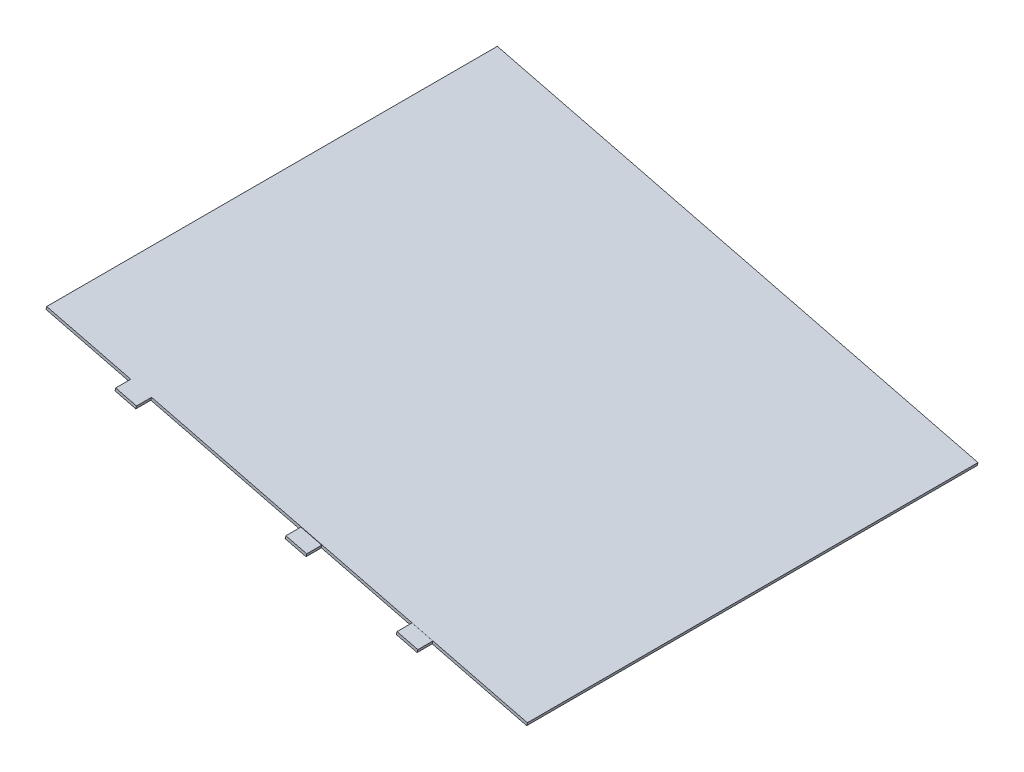
ISO-10303-21;
HEADER;
FILE_DESCRIPTION(('STEP AP214'),'2;1');
FILE_NAME('part.step','',(''),(''),'','','');
FILE_SCHEMA(('AUTOMOTIVE_DESIGN { 1 0 10303 214 1 1 1 1 }'));
ENDSEC;
DATA;
#1=APPLICATION_CONTEXT('core data for automotive mechanical design processes');
#2=APPLICATION_PROTOCOL_DEFINITION('international standard','automotive_design',2000,#1);
#3=PRODUCT_CONTEXT('',#1,'mechanical');
#4=PRODUCT('Part','Part','',(#3));
#5=PRODUCT_RELATED_PRODUCT_CATEGORY('part','',(#4));
#6=PRODUCT_DEFINITION_FORMATION('','',#4);
#7=PRODUCT_DEFINITION_CONTEXT('part definition',#1,'design');
#8=PRODUCT_DEFINITION('design','',#6,#7);
#9=PRODUCT_DEFINITION_SHAPE('','',#8);
#10=(LENGTH_UNIT() NAMED_UNIT(*) SI_UNIT(.MILLI.,.METRE.));
#11=(NAMED_UNIT(*) PLANE_ANGLE_UNIT() SI_UNIT($,.RADIAN.));
#12=(NAMED_UNIT(*) SI_UNIT($,.STERADIAN.) SOLID_ANGLE_UNIT());
#13=UNCERTAINTY_MEASURE_WITH_UNIT(LENGTH_MEASURE(1.E-05),#10,'distance_accuracy_value','');
#14=(GEOMETRIC_REPRESENTATION_CONTEXT(3) GLOBAL_UNCERTAINTY_ASSIGNED_CONTEXT((#13)) GLOBAL_UNIT_ASSIGNED_CONTEXT((#10,
#11,#12)) REPRESENTATION_CONTEXT('',''));
#15=CARTESIAN_POINT('',(0.,0.,0.));
#16=DIRECTION('',(0.,0.,1.));
#17=DIRECTION('',(1.,0.,0.));
#18=AXIS2_PLACEMENT_3D('',#15,#16,#17);
#19=CARTESIAN_POINT('',(0.,0.,1500.));
#20=DIRECTION('',(0.,0.,-1.));
#21=DIRECTION('',(-1.,0.,0.));
#22=AXIS2_PLACEMENT_3D('',#19,#20,#21);
#23=PLANE('',#22);
#24=DIRECTION('',(-0.242535625036334,-0.970142500145332,0.));
#25=VECTOR('',#24,1.);
#26=CARTESIAN_POINT('',(-1211.83076503441,187.137147040787,1500.));
#27=LINE('',#26,#25);
#28=CARTESIAN_POINT('',(-1211.83076503441,187.137147040787,1500.));
#29=VERTEX_POINT('',#28);
#30=CARTESIAN_POINT('',(-1213.94194920907,178.692410342158,1500.));
#31=VERTEX_POINT('',#30);
#32=EDGE_CURVE('E48',#29,#31,#27,.T.);
#33=ORIENTED_EDGE('',*,*,#32,.F.);
#34=DIRECTION('',(-0.970142500145332,0.242535625036334,0.));
#35=VECTOR('',#34,1.);
#36=CARTESIAN_POINT('',(-1211.83076503441,187.137147040787,1500.));
#37=LINE('',#36,#35);
#38=CARTESIAN_POINT('',(-1142.4182111473,169.78400856901,1500.));
#39=VERTEX_POINT('',#38);
#40=EDGE_CURVE('E53',#39,#29,#37,.T.);
#41=ORIENTED_EDGE('',*,*,#40,.F.);
#42=DIRECTION('',(0.242535625036334,0.970142500145332,0.));
#43=VECTOR('',#42,1.);
#44=CARTESIAN_POINT('',(-1142.4182111473,169.78400856901,1500.));
#45=LINE('',#44,#43);
#46=CARTESIAN_POINT('',(-1144.52939532196,161.339271870381,1500.));
#47=VERTEX_POINT('',#46);
#48=EDGE_CURVE('E302',#47,#39,#45,.T.);
#49=ORIENTED_EDGE('',*,*,#48,.F.);
#50=DIRECTION('',(0.970142500145332,-0.242535625036333,0.));
#51=VECTOR('',#50,1.);
#52=CARTESIAN_POINT('',(-2060.36660783462,390.298574998547,1500.));
#53=LINE('',#52,#51);
#54=CARTESIAN_POINT('',(-844.332593451995,86.2900714028894,1500.));
#55=VERTEX_POINT('',#54);
#56=EDGE_CURVE('E248',#47,#55,#53,.T.);
#57=ORIENTED_EDGE('',*,*,#56,.T.);
#58=DIRECTION('',(-0.242535625036334,-0.970142500145332,0.));
#59=VECTOR('',#58,1.);
#60=CARTESIAN_POINT('',(-841.962523584006,95.7703508748445,1500.));
#61=LINE('',#60,#59);
#62=CARTESIAN_POINT('',(-841.962523584006,95.7703508748446,1500.));
#63=VERTEX_POINT('',#62);
#64=EDGE_CURVE('E200',#63,#55,#61,.T.);
#65=ORIENTED_EDGE('',*,*,#64,.F.);
#66=DIRECTION('',(-0.970142500145332,0.242535625036334,0.));
#67=VECTOR('',#66,1.);
#68=CARTESIAN_POINT('',(-841.962523584006,95.7703508748445,1500.));
#69=LINE('',#68,#67);
#70=CARTESIAN_POINT('',(-772.549969696899,78.4172124030676,1500.));
#71=VERTEX_POINT('',#70);
#72=EDGE_CURVE('E180',#71,#63,#69,.T.);
#73=ORIENTED_EDGE('',*,*,#72,.F.);
#74=DIRECTION('',(0.242535625036334,0.970142500145332,0.));
#75=VECTOR('',#74,1.);
#76=CARTESIAN_POINT('',(-745.556962633097,186.389240658275,1500.));
#77=LINE('',#76,#75);
#78=CARTESIAN_POINT('',(-774.920039564888,68.9369329311126,1500.));
#79=VERTEX_POINT('',#78);
#80=EDGE_CURVE('E11',#79,#71,#77,.T.);
#81=ORIENTED_EDGE('',*,*,#80,.F.);
#82=CARTESIAN_POINT('',(-460.366607834624,-9.70142500145343,1500.));
#83=VERTEX_POINT('',#82);
#84=EDGE_CURVE('E270',#79,#83,#53,.T.);
#85=ORIENTED_EDGE('',*,*,#84,.T.);
#86=DIRECTION('',(-0.242535625036268,-0.970142500145348,0.));
#87=VECTOR('',#86,1.);
#88=CARTESIAN_POINT('',(-457.941251584261,0.,1500.));
#89=LINE('',#88,#87);
#90=CARTESIAN_POINT('',(-457.941251584261,0.,1500.));
#91=VERTEX_POINT('',#90);
#92=EDGE_CURVE('E246',#91,#83,#89,.T.);
#93=ORIENTED_EDGE('',*,*,#92,.F.);
#94=DIRECTION('',(0.970142500145332,-0.242535625036333,0.));
#95=VECTOR('',#94,1.);
#96=CARTESIAN_POINT('',(-2057.94125158426,400.,1500.));
#97=LINE('',#96,#95);
#98=CARTESIAN_POINT('',(-1708.88396011743,312.735677133292,1500.));
#99=VERTEX_POINT('',#98);
#100=EDGE_CURVE('E251',#99,#91,#97,.T.);
#101=ORIENTED_EDGE('',*,*,#100,.F.);
#102=DIRECTION('',(-0.242535625036334,-0.970142500145332,0.));
#103=VECTOR('',#102,1.);
#104=CARTESIAN_POINT('',(-1708.88396011743,312.735677133292,1500.));
#105=LINE('',#104,#103);
#106=CARTESIAN_POINT('',(-1711.30931636779,303.034252131839,1500.));
#107=VERTEX_POINT('',#106);
#108=EDGE_CURVE('E218',#99,#107,#105,.T.);
#109=ORIENTED_EDGE('',*,*,#108,.T.);
#110=EDGE_CURVE('E247',#107,#31,#53,.T.);
#111=ORIENTED_EDGE('',*,*,#110,.T.);
#112=EDGE_LOOP('',(#33,#41,#49,#57,#65,#73,#81,#85,#93,#101,#109,#111));
#113=FACE_BOUND('',#112,.T.);
#114=ADVANCED_FACE('F33',(#113),#23,.F.);
#115=DIRECTION('',(-0.242535625036334,-0.970142500145332,0.));
#116=VECTOR('',#115,1.);
#117=CARTESIAN_POINT('',(-1778.29651400454,330.088815605069,1500.));
#118=LINE('',#117,#116);
#119=CARTESIAN_POINT('',(-1778.29651400454,330.088815605069,1500.));
#120=VERTEX_POINT('',#119);
#121=CARTESIAN_POINT('',(-1780.7218702549,320.387390603616,1500.));
#122=VERTEX_POINT('',#121);
#123=EDGE_CURVE('E222',#120,#122,#118,.T.);
#124=ORIENTED_EDGE('',*,*,#123,.F.);
#125=CARTESIAN_POINT('',(-2057.94125158426,400.,1500.));
#126=VERTEX_POINT('',#125);
#127=EDGE_CURVE('E252',#126,#120,#97,.T.);
#128=ORIENTED_EDGE('',*,*,#127,.F.);
#129=DIRECTION('',(0.242535625036312,0.970142500145337,0.));
#130=VECTOR('',#129,1.);
#131=CARTESIAN_POINT('',(-2060.36660783462,390.298574998547,1500.));
#132=LINE('',#131,#130);
#133=CARTESIAN_POINT('',(-2060.36660783462,390.298574998547,1500.));
#134=VERTEX_POINT('',#133);
#135=EDGE_CURVE('E255',#134,#126,#132,.T.);
#136=ORIENTED_EDGE('',*,*,#135,.F.);
#137=EDGE_CURVE('E243',#134,#122,#53,.T.);
#138=ORIENTED_EDGE('',*,*,#137,.T.);
#139=EDGE_LOOP('',(#124,#128,#136,#138));
#140=FACE_BOUND('',#139,.T.);
#141=ADVANCED_FACE('F337',(#140),#23,.F.);
#142=CARTESIAN_POINT('',(-2060.36660783462,390.298574998547,1500.));
#143=DIRECTION('',(0.242535625036333,0.970142500145332,0.));
#144=DIRECTION('',(-0.970142500145332,0.242535625036333,0.));
#145=AXIS2_PLACEMENT_3D('',#142,#143,#144);
#146=PLANE('',#145);
#147=DIRECTION('',(0.970142500145332,-0.242535625036333,0.));
#148=VECTOR('',#147,1.);
#149=CARTESIAN_POINT('',(-2060.36660783462,390.298574998547,0.));
#150=LINE('',#149,#148);
#151=CARTESIAN_POINT('',(-2060.36660783462,390.298574998547,0.));
#152=VERTEX_POINT('',#151);
#153=CARTESIAN_POINT('',(-460.366607834624,-9.70142500145343,0.));
#154=VERTEX_POINT('',#153);
#155=EDGE_CURVE('E242',#152,#154,#150,.T.);
#156=ORIENTED_EDGE('',*,*,#155,.T.);
#157=DIRECTION('',(0.,0.,-1.));
#158=VECTOR('',#157,1.);
#159=CARTESIAN_POINT('',(-460.366607834624,-9.70142500145343,1500.));
#160=LINE('',#159,#158);
#161=EDGE_CURVE('E41',#83,#154,#160,.T.);
#162=ORIENTED_EDGE('',*,*,#161,.F.);
#163=ORIENTED_EDGE('',*,*,#84,.F.);
#164=EDGE_CURVE('E295',#55,#79,#53,.T.);
#165=ORIENTED_EDGE('',*,*,#164,.F.);
#166=ORIENTED_EDGE('',*,*,#56,.F.);
#167=EDGE_CURVE('E296',#31,#47,#53,.T.);
#168=ORIENTED_EDGE('',*,*,#167,.F.);
#169=ORIENTED_EDGE('',*,*,#110,.F.);
#170=DIRECTION('',(0.,0.,-1.));
#171=VECTOR('',#170,1.);
#172=CARTESIAN_POINT('',(-1711.30931636779,303.034252131839,1550.));
#173=LINE('',#172,#171);
#174=CARTESIAN_POINT('',(-1711.30931636779,303.034252131839,1550.));
#175=VERTEX_POINT('',#174);
#176=EDGE_CURVE('E240',#175,#107,#173,.T.);
#177=ORIENTED_EDGE('',*,*,#176,.F.);
#178=DIRECTION('',(0.970142500145332,-0.242535625036334,0.));
#179=VECTOR('',#178,1.);
#180=CARTESIAN_POINT('',(-1780.7218702549,320.387390603616,1550.));
#181=LINE('',#180,#179);
#182=CARTESIAN_POINT('',(-1780.7218702549,320.387390603616,1550.));
#183=VERTEX_POINT('',#182);
#184=EDGE_CURVE('E219',#183,#175,#181,.T.);
#185=ORIENTED_EDGE('',*,*,#184,.F.);
#186=DIRECTION('',(0.,0.,-1.));
#187=VECTOR('',#186,1.);
#188=CARTESIAN_POINT('',(-1780.7218702549,320.387390603616,1550.));
#189=LINE('',#188,#187);
#190=EDGE_CURVE('E230',#183,#122,#189,.T.);
#191=ORIENTED_EDGE('',*,*,#190,.T.);
#192=ORIENTED_EDGE('',*,*,#137,.F.);
#193=DIRECTION('',(0.,0.,-1.));
#194=VECTOR('',#193,1.);
#195=CARTESIAN_POINT('',(-2060.36660783462,390.298574998547,1500.));
#196=LINE('',#195,#194);
#197=EDGE_CURVE('E258',#134,#152,#196,.T.);
#198=ORIENTED_EDGE('',*,*,#197,.T.);
#199=EDGE_LOOP('',(#156,#162,#163,#165,#166,#168,#169,#177,#185,#191,#192,#198));
#200=FACE_BOUND('',#199,.T.);
#201=ADVANCED_FACE('F35',(#200),#146,.F.);
#202=CARTESIAN_POINT('',(-457.941251584261,0.,1500.));
#203=DIRECTION('',(0.970142500145348,-0.242535625036268,0.));
#204=DIRECTION('',(0.242535625036268,0.970142500145348,0.));
#205=AXIS2_PLACEMENT_3D('',#202,#203,#204);
#206=PLANE('',#205);
#207=DIRECTION('',(-0.242535625036268,-0.970142500145348,0.));
#208=VECTOR('',#207,1.);
#209=CARTESIAN_POINT('',(-457.941251584261,0.,0.));
#210=LINE('',#209,#208);
#211=CARTESIAN_POINT('',(-457.941251584261,0.,0.));
#212=VERTEX_POINT('',#211);
#213=EDGE_CURVE('E261',#212,#154,#210,.T.);
#214=ORIENTED_EDGE('',*,*,#213,.F.);
#215=DIRECTION('',(0.,0.,-1.));
#216=VECTOR('',#215,1.);
#217=CARTESIAN_POINT('',(-457.941251584261,0.,1500.));
#218=LINE('',#217,#216);
#219=EDGE_CURVE('E274',#91,#212,#218,.T.);
#220=ORIENTED_EDGE('',*,*,#219,.F.);
#221=ORIENTED_EDGE('',*,*,#92,.T.);
#222=ORIENTED_EDGE('',*,*,#161,.T.);
#223=EDGE_LOOP('',(#214,#220,#221,#222));
#224=FACE_BOUND('',#223,.T.);
#225=ADVANCED_FACE('F278',(#224),#206,.T.);
#226=CARTESIAN_POINT('',(-2057.94125158426,400.,1500.));
#227=DIRECTION('',(0.242535625036333,0.970142500145332,0.));
#228=DIRECTION('',(-0.970142500145332,0.242535625036333,0.));
#229=AXIS2_PLACEMENT_3D('',#226,#227,#228);
#230=PLANE('',#229);
#231=DIRECTION('',(0.970142500145332,-0.242535625036333,0.));
#232=VECTOR('',#231,1.);
#233=CARTESIAN_POINT('',(-2057.94125158426,400.,0.));
#234=LINE('',#233,#232);
#235=CARTESIAN_POINT('',(-2057.94125158426,400.,0.));
#236=VERTEX_POINT('',#235);
#237=EDGE_CURVE('E264',#236,#212,#234,.T.);
#238=ORIENTED_EDGE('',*,*,#237,.F.);
#239=DIRECTION('',(0.,0.,-1.));
#240=VECTOR('',#239,1.);
#241=CARTESIAN_POINT('',(-2057.94125158426,400.,1500.));
#242=LINE('',#241,#240);
#243=EDGE_CURVE('E272',#126,#236,#242,.T.);
#244=ORIENTED_EDGE('',*,*,#243,.F.);
#245=ORIENTED_EDGE('',*,*,#127,.T.);
#246=DIRECTION('',(0.,0.,-1.));
#247=VECTOR('',#246,1.);
#248=CARTESIAN_POINT('',(-1778.29651400454,330.088815605069,1550.));
#249=LINE('',#248,#247);
#250=CARTESIAN_POINT('',(-1778.29651400454,330.088815605069,1550.));
#251=VERTEX_POINT('',#250);
#252=EDGE_CURVE('E236',#251,#120,#249,.T.);
#253=ORIENTED_EDGE('',*,*,#252,.F.);
#254=DIRECTION('',(0.970142500145332,-0.242535625036334,0.));
#255=VECTOR('',#254,1.);
#256=CARTESIAN_POINT('',(-1778.29651400454,330.088815605069,1550.));
#257=LINE('',#256,#255);
#258=CARTESIAN_POINT('',(-1708.88396011743,312.735677133292,1550.));
#259=VERTEX_POINT('',#258);
#260=EDGE_CURVE('E225',#251,#259,#257,.T.);
#261=ORIENTED_EDGE('',*,*,#260,.T.);
#262=DIRECTION('',(0.,0.,-1.));
#263=VECTOR('',#262,1.);
#264=CARTESIAN_POINT('',(-1708.88396011743,312.735677133292,1550.));
#265=LINE('',#264,#263);
#266=EDGE_CURVE('E238',#259,#99,#265,.T.);
#267=ORIENTED_EDGE('',*,*,#266,.T.);
#268=ORIENTED_EDGE('',*,*,#100,.T.);
#269=ORIENTED_EDGE('',*,*,#219,.T.);
#270=EDGE_LOOP('',(#238,#244,#245,#253,#261,#267,#268,#269));
#271=FACE_BOUND('',#270,.T.);
#272=ADVANCED_FACE('F290',(#271),#230,.T.);
#273=CARTESIAN_POINT('',(-2060.36660783462,390.298574998547,1500.));
#274=DIRECTION('',(-0.970142500145337,0.242535625036312,0.));
#275=DIRECTION('',(-0.242535625036312,-0.970142500145337,0.));
#276=AXIS2_PLACEMENT_3D('',#273,#274,#275);
#277=PLANE('',#276);
#278=DIRECTION('',(0.242535625036312,0.970142500145337,0.));
#279=VECTOR('',#278,1.);
#280=CARTESIAN_POINT('',(-2060.36660783462,390.298574998547,0.));
#281=LINE('',#280,#279);
#282=EDGE_CURVE('E267',#152,#236,#281,.T.);
#283=ORIENTED_EDGE('',*,*,#282,.F.);
#284=ORIENTED_EDGE('',*,*,#197,.F.);
#285=ORIENTED_EDGE('',*,*,#135,.T.);
#286=ORIENTED_EDGE('',*,*,#243,.T.);
#287=EDGE_LOOP('',(#283,#284,#285,#286));
#288=FACE_BOUND('',#287,.T.);
#289=ADVANCED_FACE('F349',(#288),#277,.T.);
#290=CARTESIAN_POINT('',(0.,0.,0.));
#291=DIRECTION('',(0.,0.,-1.));
#292=DIRECTION('',(-1.,0.,0.));
#293=AXIS2_PLACEMENT_3D('',#290,#291,#292);
#294=PLANE('',#293);
#295=ORIENTED_EDGE('',*,*,#155,.F.);
#296=ORIENTED_EDGE('',*,*,#282,.T.);
#297=ORIENTED_EDGE('',*,*,#237,.T.);
#298=ORIENTED_EDGE('',*,*,#213,.T.);
#299=EDGE_LOOP('',(#295,#296,#297,#298));
#300=FACE_BOUND('',#299,.T.);
#301=ADVANCED_FACE('F287',(#300),#294,.T.);
#302=CARTESIAN_POINT('',(-1708.88396011743,312.735677133292,1550.));
#303=DIRECTION('',(0.970142500145332,-0.242535625036334,0.));
#304=DIRECTION('',(0.242535625036334,0.970142500145332,0.));
#305=AXIS2_PLACEMENT_3D('',#302,#303,#304);
#306=PLANE('',#305);
#307=ORIENTED_EDGE('',*,*,#108,.F.);
#308=ORIENTED_EDGE('',*,*,#266,.F.);
#309=DIRECTION('',(-0.242535625036334,-0.970142500145332,0.));
#310=VECTOR('',#309,1.);
#311=CARTESIAN_POINT('',(-1708.88396011743,312.735677133292,1550.));
#312=LINE('',#311,#310);
#313=EDGE_CURVE('E221',#259,#175,#312,.T.);
#314=ORIENTED_EDGE('',*,*,#313,.T.);
#315=ORIENTED_EDGE('',*,*,#176,.T.);
#316=EDGE_LOOP('',(#307,#308,#314,#315));
#317=FACE_BOUND('',#316,.T.);
#318=ADVANCED_FACE('F345',(#317),#306,.T.);
#319=CARTESIAN_POINT('',(-1778.29651400454,330.088815605069,1550.));
#320=DIRECTION('',(0.970142500145332,-0.242535625036334,0.));
#321=DIRECTION('',(0.242535625036334,0.970142500145332,0.));
#322=AXIS2_PLACEMENT_3D('',#319,#320,#321);
#323=PLANE('',#322);
#324=ORIENTED_EDGE('',*,*,#123,.T.);
#325=ORIENTED_EDGE('',*,*,#190,.F.);
#326=DIRECTION('',(-0.242535625036334,-0.970142500145332,0.));
#327=VECTOR('',#326,1.);
#328=CARTESIAN_POINT('',(-1778.29651400454,330.088815605069,1550.));
#329=LINE('',#328,#327);
#330=EDGE_CURVE('E228',#251,#183,#329,.T.);
#331=ORIENTED_EDGE('',*,*,#330,.F.);
#332=ORIENTED_EDGE('',*,*,#252,.T.);
#333=EDGE_LOOP('',(#324,#325,#331,#332));
#334=FACE_BOUND('',#333,.T.);
#335=ADVANCED_FACE('F385',(#334),#323,.F.);
#336=CARTESIAN_POINT('',(0.,0.,1550.));
#337=DIRECTION('',(0.,0.,-1.));
#338=DIRECTION('',(-1.,0.,0.));
#339=AXIS2_PLACEMENT_3D('',#336,#337,#338);
#340=PLANE('',#339);
#341=ORIENTED_EDGE('',*,*,#184,.T.);
#342=ORIENTED_EDGE('',*,*,#313,.F.);
#343=ORIENTED_EDGE('',*,*,#260,.F.);
#344=ORIENTED_EDGE('',*,*,#330,.T.);
#345=EDGE_LOOP('',(#341,#342,#343,#344));
#346=FACE_BOUND('',#345,.T.);
#347=ADVANCED_FACE('F394',(#346),#340,.F.);
#348=CARTESIAN_POINT('',(0.,0.,1500.));
#349=DIRECTION('',(0.,0.,-1.));
#350=DIRECTION('',(-1.,0.,0.));
#351=AXIS2_PLACEMENT_3D('',#348,#349,#350);
#352=PLANE('',#351);
#353=ORIENTED_EDGE('',*,*,#164,.T.);
#354=DIRECTION('',(0.242535625036334,0.970142500145332,0.));
#355=VECTOR('',#354,1.);
#356=CARTESIAN_POINT('',(-772.549969696899,78.4172124030676,1500.));
#357=LINE('',#356,#355);
#358=CARTESIAN_POINT('',(-774.975325947262,68.7157874016143,1500.));
#359=VERTEX_POINT('',#358);
#360=EDGE_CURVE('E193',#359,#79,#357,.T.);
#361=ORIENTED_EDGE('',*,*,#360,.F.);
#362=DIRECTION('',(0.970142500145332,-0.242535625036334,0.));
#363=VECTOR('',#362,1.);
#364=CARTESIAN_POINT('',(-844.38787983437,86.0689258733913,1500.));
#365=LINE('',#364,#363);
#366=CARTESIAN_POINT('',(-844.38787983437,86.0689258733913,1500.));
#367=VERTEX_POINT('',#366);
#368=EDGE_CURVE('E203',#367,#359,#365,.T.);
#369=ORIENTED_EDGE('',*,*,#368,.F.);
#370=EDGE_CURVE('E183',#55,#367,#61,.T.);
#371=ORIENTED_EDGE('',*,*,#370,.F.);
#372=EDGE_LOOP('',(#353,#361,#369,#371));
#373=FACE_BOUND('',#372,.T.);
#374=ADVANCED_FACE('F307',(#373),#352,.T.);
#375=CARTESIAN_POINT('',(-841.962523584006,95.7703508748445,1550.));
#376=DIRECTION('',(-0.242535625036334,-0.970142500145332,0.));
#377=DIRECTION('',(0.970142500145332,-0.242535625036334,0.));
#378=AXIS2_PLACEMENT_3D('',#375,#376,#377);
#379=PLANE('',#378);
#380=ORIENTED_EDGE('',*,*,#72,.T.);
#381=DIRECTION('',(0.,0.,-1.));
#382=VECTOR('',#381,1.);
#383=CARTESIAN_POINT('',(-841.962523584006,95.7703508748445,1550.));
#384=LINE('',#383,#382);
#385=CARTESIAN_POINT('',(-841.962523584006,95.7703508748445,1550.));
#386=VERTEX_POINT('',#385);
#387=EDGE_CURVE('E215',#386,#63,#384,.T.);
#388=ORIENTED_EDGE('',*,*,#387,.F.);
#389=DIRECTION('',(-0.970142500145332,0.242535625036334,0.));
#390=VECTOR('',#389,1.);
#391=CARTESIAN_POINT('',(-841.962523584006,95.7703508748445,1550.));
#392=LINE('',#391,#390);
#393=CARTESIAN_POINT('',(-772.549969696899,78.4172124030676,1550.));
#394=VERTEX_POINT('',#393);
#395=EDGE_CURVE('E189',#394,#386,#392,.T.);
#396=ORIENTED_EDGE('',*,*,#395,.F.);
#397=DIRECTION('',(0.,0.,-1.));
#398=VECTOR('',#397,1.);
#399=CARTESIAN_POINT('',(-772.549969696899,78.4172124030676,1550.));
#400=LINE('',#399,#398);
#401=EDGE_CURVE('E198',#394,#71,#400,.T.);
#402=ORIENTED_EDGE('',*,*,#401,.T.);
#403=EDGE_LOOP('',(#380,#388,#396,#402));
#404=FACE_BOUND('',#403,.T.);
#405=ADVANCED_FACE('F314',(#404),#379,.F.);
#406=CARTESIAN_POINT('',(-841.962523584006,95.7703508748445,1550.));
#407=DIRECTION('',(0.970142500145332,-0.242535625036334,0.));
#408=DIRECTION('',(0.242535625036334,0.970142500145332,0.));
#409=AXIS2_PLACEMENT_3D('',#406,#407,#408);
#410=PLANE('',#409);
#411=ORIENTED_EDGE('',*,*,#64,.T.);
#412=ORIENTED_EDGE('',*,*,#370,.T.);
#413=DIRECTION('',(0.,0.,-1.));
#414=VECTOR('',#413,1.);
#415=CARTESIAN_POINT('',(-844.38787983437,86.0689258733913,1550.));
#416=LINE('',#415,#414);
#417=CARTESIAN_POINT('',(-844.38787983437,86.0689258733913,1550.));
#418=VERTEX_POINT('',#417);
#419=EDGE_CURVE('E212',#418,#367,#416,.T.);
#420=ORIENTED_EDGE('',*,*,#419,.F.);
#421=DIRECTION('',(-0.242535625036334,-0.970142500145332,0.));
#422=VECTOR('',#421,1.);
#423=CARTESIAN_POINT('',(-841.962523584006,95.7703508748445,1550.));
#424=LINE('',#423,#422);
#425=EDGE_CURVE('E192',#386,#418,#424,.T.);
#426=ORIENTED_EDGE('',*,*,#425,.F.);
#427=ORIENTED_EDGE('',*,*,#387,.T.);
#428=EDGE_LOOP('',(#411,#412,#420,#426,#427));
#429=FACE_BOUND('',#428,.T.);
#430=ADVANCED_FACE('F310',(#429),#410,.F.);
#431=CARTESIAN_POINT('',(-844.38787983437,86.0689258733913,1550.));
#432=DIRECTION('',(0.242535625036334,0.970142500145332,0.));
#433=DIRECTION('',(-0.970142500145332,0.242535625036334,0.));
#434=AXIS2_PLACEMENT_3D('',#431,#432,#433);
#435=PLANE('',#434);
#436=ORIENTED_EDGE('',*,*,#368,.T.);
#437=DIRECTION('',(0.,0.,-1.));
#438=VECTOR('',#437,1.);
#439=CARTESIAN_POINT('',(-774.975325947262,68.7157874016143,1550.));
#440=LINE('',#439,#438);
#441=CARTESIAN_POINT('',(-774.975325947262,68.7157874016143,1550.));
#442=VERTEX_POINT('',#441);
#443=EDGE_CURVE('E209',#442,#359,#440,.T.);
#444=ORIENTED_EDGE('',*,*,#443,.F.);
#445=DIRECTION('',(0.970142500145332,-0.242535625036334,0.));
#446=VECTOR('',#445,1.);
#447=CARTESIAN_POINT('',(-844.38787983437,86.0689258733913,1550.));
#448=LINE('',#447,#446);
#449=EDGE_CURVE('E195',#418,#442,#448,.T.);
#450=ORIENTED_EDGE('',*,*,#449,.F.);
#451=ORIENTED_EDGE('',*,*,#419,.T.);
#452=EDGE_LOOP('',(#436,#444,#450,#451));
#453=FACE_BOUND('',#452,.T.);
#454=ADVANCED_FACE('F322',(#453),#435,.F.);
#455=CARTESIAN_POINT('',(-772.549969696899,78.4172124030676,1550.));
#456=DIRECTION('',(-0.970142500145332,0.242535625036334,0.));
#457=DIRECTION('',(-0.242535625036334,-0.970142500145332,0.));
#458=AXIS2_PLACEMENT_3D('',#455,#456,#457);
#459=PLANE('',#458);
#460=ORIENTED_EDGE('',*,*,#360,.T.);
#461=ORIENTED_EDGE('',*,*,#80,.T.);
#462=ORIENTED_EDGE('',*,*,#401,.F.);
#463=DIRECTION('',(0.242535625036334,0.970142500145332,0.));
#464=VECTOR('',#463,1.);
#465=CARTESIAN_POINT('',(-772.549969696899,78.4172124030676,1550.));
#466=LINE('',#465,#464);
#467=EDGE_CURVE('E197',#442,#394,#466,.T.);
#468=ORIENTED_EDGE('',*,*,#467,.F.);
#469=ORIENTED_EDGE('',*,*,#443,.T.);
#470=EDGE_LOOP('',(#460,#461,#462,#468,#469));
#471=FACE_BOUND('',#470,.T.);
#472=ADVANCED_FACE('F317',(#471),#459,.F.);
#473=CARTESIAN_POINT('',(0.,0.,1550.));
#474=DIRECTION('',(0.,0.,-1.));
#475=DIRECTION('',(-1.,0.,0.));
#476=AXIS2_PLACEMENT_3D('',#473,#474,#475);
#477=PLANE('',#476);
#478=ORIENTED_EDGE('',*,*,#395,.T.);
#479=ORIENTED_EDGE('',*,*,#425,.T.);
#480=ORIENTED_EDGE('',*,*,#449,.T.);
#481=ORIENTED_EDGE('',*,*,#467,.T.);
#482=EDGE_LOOP('',(#478,#479,#480,#481));
#483=FACE_BOUND('',#482,.T.);
#484=ADVANCED_FACE('F324',(#483),#477,.F.);
#485=CARTESIAN_POINT('',(0.,0.,1500.));
#486=DIRECTION('',(0.,0.,-1.));
#487=DIRECTION('',(-1.,0.,0.));
#488=AXIS2_PLACEMENT_3D('',#485,#486,#487);
#489=PLANE('',#488);
#490=ORIENTED_EDGE('',*,*,#167,.T.);
#491=CARTESIAN_POINT('',(-1144.84356739767,160.082583567557,1500.));
#492=VERTEX_POINT('',#491);
#493=EDGE_CURVE('E177',#492,#47,#45,.T.);
#494=ORIENTED_EDGE('',*,*,#493,.F.);
#495=DIRECTION('',(0.970142500145332,-0.242535625036334,0.));
#496=VECTOR('',#495,1.);
#497=CARTESIAN_POINT('',(-1214.25612128477,177.435722039334,1500.));
#498=LINE('',#497,#496);
#499=CARTESIAN_POINT('',(-1214.25612128477,177.435722039334,1500.));
#500=VERTEX_POINT('',#499);
#501=EDGE_CURVE('E504',#500,#492,#498,.T.);
#502=ORIENTED_EDGE('',*,*,#501,.F.);
#503=EDGE_CURVE('E512',#31,#500,#27,.T.);
#504=ORIENTED_EDGE('',*,*,#503,.F.);
#505=EDGE_LOOP('',(#490,#494,#502,#504));
#506=FACE_BOUND('',#505,.T.);
#507=ADVANCED_FACE('F326',(#506),#489,.T.);
#508=CARTESIAN_POINT('',(-1211.83076503441,187.137147040787,1550.));
#509=DIRECTION('',(-0.242535625036334,-0.970142500145332,0.));
#510=DIRECTION('',(0.970142500145332,-0.242535625036334,0.));
#511=AXIS2_PLACEMENT_3D('',#508,#509,#510);
#512=PLANE('',#511);
#513=ORIENTED_EDGE('',*,*,#40,.T.);
#514=DIRECTION('',(0.,0.,-1.));
#515=VECTOR('',#514,1.);
#516=CARTESIAN_POINT('',(-1211.83076503441,187.137147040787,1550.));
#517=LINE('',#516,#515);
#518=CARTESIAN_POINT('',(-1211.83076503441,187.137147040787,1550.));
#519=VERTEX_POINT('',#518);
#520=EDGE_CURVE('E162',#519,#29,#517,.T.);
#521=ORIENTED_EDGE('',*,*,#520,.F.);
#522=DIRECTION('',(-0.970142500145332,0.242535625036334,0.));
#523=VECTOR('',#522,1.);
#524=CARTESIAN_POINT('',(-1211.83076503441,187.137147040787,1550.));
#525=LINE('',#524,#523);
#526=CARTESIAN_POINT('',(-1142.4182111473,169.78400856901,1550.));
#527=VERTEX_POINT('',#526);
#528=EDGE_CURVE('E168',#527,#519,#525,.T.);
#529=ORIENTED_EDGE('',*,*,#528,.F.);
#530=DIRECTION('',(0.,0.,-1.));
#531=VECTOR('',#530,1.);
#532=CARTESIAN_POINT('',(-1142.4182111473,169.78400856901,1550.));
#533=LINE('',#532,#531);
#534=EDGE_CURVE('E508',#527,#39,#533,.T.);
#535=ORIENTED_EDGE('',*,*,#534,.T.);
#536=EDGE_LOOP('',(#513,#521,#529,#535));
#537=FACE_BOUND('',#536,.T.);
#538=ADVANCED_FACE('F179',(#537),#512,.F.);
#539=CARTESIAN_POINT('',(-1211.83076503441,187.137147040787,1550.));
#540=DIRECTION('',(0.970142500145332,-0.242535625036334,0.));
#541=DIRECTION('',(0.242535625036334,0.970142500145332,0.));
#542=AXIS2_PLACEMENT_3D('',#539,#540,#541);
#543=PLANE('',#542);
#544=ORIENTED_EDGE('',*,*,#32,.T.);
#545=ORIENTED_EDGE('',*,*,#503,.T.);
#546=DIRECTION('',(0.,0.,-1.));
#547=VECTOR('',#546,1.);
#548=CARTESIAN_POINT('',(-1214.25612128477,177.435722039334,1550.));
#549=LINE('',#548,#547);
#550=CARTESIAN_POINT('',(-1214.25612128477,177.435722039334,1550.));
#551=VERTEX_POINT('',#550);
#552=EDGE_CURVE('E164',#551,#500,#549,.T.);
#553=ORIENTED_EDGE('',*,*,#552,.F.);
#554=DIRECTION('',(-0.242535625036334,-0.970142500145332,0.));
#555=VECTOR('',#554,1.);
#556=CARTESIAN_POINT('',(-1211.83076503441,187.137147040787,1550.));
#557=LINE('',#556,#555);
#558=EDGE_CURVE('E158',#519,#551,#557,.T.);
#559=ORIENTED_EDGE('',*,*,#558,.F.);
#560=ORIENTED_EDGE('',*,*,#520,.T.);
#561=EDGE_LOOP('',(#544,#545,#553,#559,#560));
#562=FACE_BOUND('',#561,.T.);
#563=ADVANCED_FACE('F160',(#562),#543,.F.);
#564=CARTESIAN_POINT('',(-1214.25612128477,177.435722039334,1550.));
#565=DIRECTION('',(0.242535625036334,0.970142500145332,0.));
#566=DIRECTION('',(-0.970142500145332,0.242535625036334,0.));
#567=AXIS2_PLACEMENT_3D('',#564,#565,#566);
#568=PLANE('',#567);
#569=ORIENTED_EDGE('',*,*,#501,.T.);
#570=DIRECTION('',(0.,0.,-1.));
#571=VECTOR('',#570,1.);
#572=CARTESIAN_POINT('',(-1144.84356739767,160.082583567557,1550.));
#573=LINE('',#572,#571);
#574=CARTESIAN_POINT('',(-1144.84356739767,160.082583567557,1550.));
#575=VERTEX_POINT('',#574);
#576=EDGE_CURVE('E185',#575,#492,#573,.T.);
#577=ORIENTED_EDGE('',*,*,#576,.F.);
#578=DIRECTION('',(0.970142500145332,-0.242535625036334,0.));
#579=VECTOR('',#578,1.);
#580=CARTESIAN_POINT('',(-1214.25612128477,177.435722039334,1550.));
#581=LINE('',#580,#579);
#582=EDGE_CURVE('E167',#551,#575,#581,.T.);
#583=ORIENTED_EDGE('',*,*,#582,.F.);
#584=ORIENTED_EDGE('',*,*,#552,.T.);
#585=EDGE_LOOP('',(#569,#577,#583,#584));
#586=FACE_BOUND('',#585,.T.);
#587=ADVANCED_FACE('F468',(#586),#568,.F.);
#588=CARTESIAN_POINT('',(-1142.4182111473,169.78400856901,1550.));
#589=DIRECTION('',(-0.970142500145332,0.242535625036334,0.));
#590=DIRECTION('',(-0.242535625036334,-0.970142500145332,0.));
#591=AXIS2_PLACEMENT_3D('',#588,#589,#590);
#592=PLANE('',#591);
#593=ORIENTED_EDGE('',*,*,#493,.T.);
#594=ORIENTED_EDGE('',*,*,#48,.T.);
#595=ORIENTED_EDGE('',*,*,#534,.F.);
#596=DIRECTION('',(0.242535625036334,0.970142500145332,0.));
#597=VECTOR('',#596,1.);
#598=CARTESIAN_POINT('',(-1142.4182111473,169.78400856901,1550.));
#599=LINE('',#598,#597);
#600=EDGE_CURVE('E173',#575,#527,#599,.T.);
#601=ORIENTED_EDGE('',*,*,#600,.F.);
#602=ORIENTED_EDGE('',*,*,#576,.T.);
#603=EDGE_LOOP('',(#593,#594,#595,#601,#602));
#604=FACE_BOUND('',#603,.T.);
#605=ADVANCED_FACE('F476',(#604),#592,.F.);
#606=CARTESIAN_POINT('',(0.,0.,1550.));
#607=DIRECTION('',(0.,0.,-1.));
#608=DIRECTION('',(-1.,0.,0.));
#609=AXIS2_PLACEMENT_3D('',#606,#607,#608);
#610=PLANE('',#609);
#611=ORIENTED_EDGE('',*,*,#528,.T.);
#612=ORIENTED_EDGE('',*,*,#558,.T.);
#613=ORIENTED_EDGE('',*,*,#582,.T.);
#614=ORIENTED_EDGE('',*,*,#600,.T.);
#615=EDGE_LOOP('',(#611,#612,#613,#614));
#616=FACE_BOUND('',#615,.T.);
#617=ADVANCED_FACE('F171',(#616),#610,.F.);
#618=CLOSED_SHELL('',(#114,#141,#201,#225,#272,#289,#301,#318,#335,#347,#374,#405,#430,#454,
#472,#484,#507,#538,#563,#587,#605,#617));
#619=MANIFOLD_SOLID_BREP('B2',#618);
#620=ADVANCED_BREP_SHAPE_REPRESENTATION('',(#18,#619),#14);
#621=SHAPE_DEFINITION_REPRESENTATION(#9,#620);
ENDSEC;
END-ISO-10303-21;
